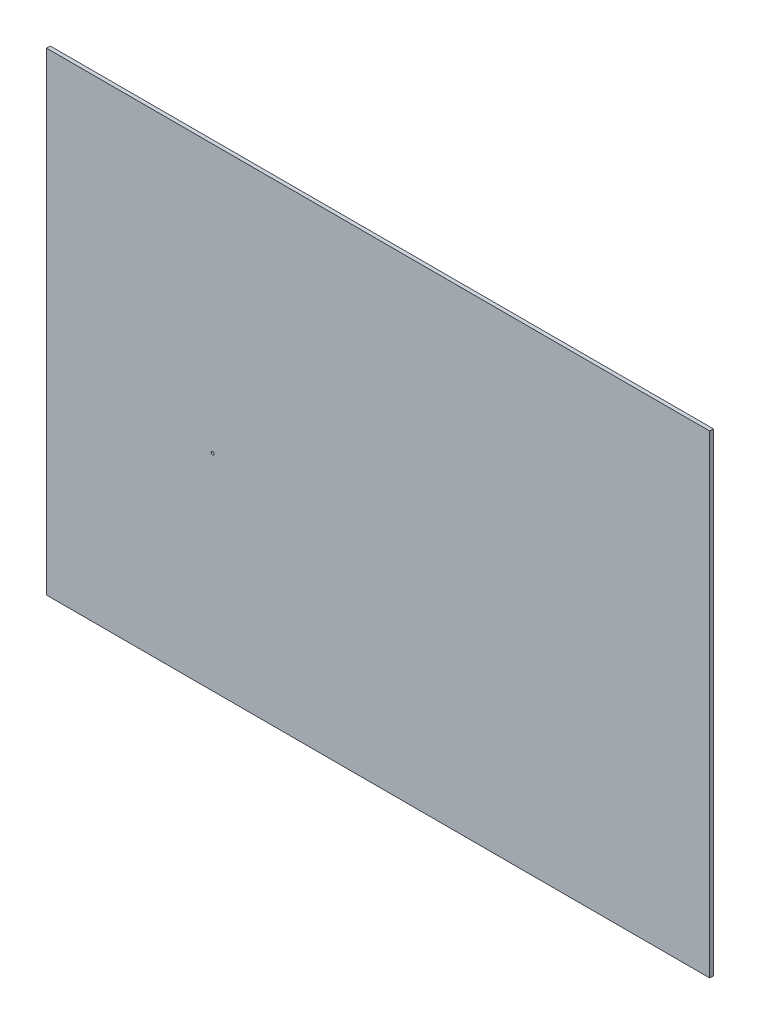
ISO-10303-21;
HEADER;
FILE_DESCRIPTION(('STEP AP214'),'2;1');
FILE_NAME('part.step','',(''),(''),'','','');
FILE_SCHEMA(('AUTOMOTIVE_DESIGN { 1 0 10303 214 1 1 1 1 }'));
ENDSEC;
DATA;
#1=APPLICATION_CONTEXT('core data for automotive mechanical design processes');
#2=APPLICATION_PROTOCOL_DEFINITION('international standard','automotive_design',2000,#1);
#3=PRODUCT_CONTEXT('',#1,'mechanical');
#4=PRODUCT('Part','Part','',(#3));
#5=PRODUCT_RELATED_PRODUCT_CATEGORY('part','',(#4));
#6=PRODUCT_DEFINITION_FORMATION('','',#4);
#7=PRODUCT_DEFINITION_CONTEXT('part definition',#1,'design');
#8=PRODUCT_DEFINITION('design','',#6,#7);
#9=PRODUCT_DEFINITION_SHAPE('','',#8);
#10=(LENGTH_UNIT() NAMED_UNIT(*) SI_UNIT(.MILLI.,.METRE.));
#11=(NAMED_UNIT(*) PLANE_ANGLE_UNIT() SI_UNIT($,.RADIAN.));
#12=(NAMED_UNIT(*) SI_UNIT($,.STERADIAN.) SOLID_ANGLE_UNIT());
#13=UNCERTAINTY_MEASURE_WITH_UNIT(LENGTH_MEASURE(1.E-05),#10,'distance_accuracy_value','');
#14=(GEOMETRIC_REPRESENTATION_CONTEXT(3) GLOBAL_UNCERTAINTY_ASSIGNED_CONTEXT((#13)) GLOBAL_UNIT_ASSIGNED_CONTEXT((#10,
#11,#12)) REPRESENTATION_CONTEXT('',''));
#15=CARTESIAN_POINT('',(0.,0.,0.));
#16=DIRECTION('',(0.,0.,1.));
#17=DIRECTION('',(1.,0.,0.));
#18=AXIS2_PLACEMENT_3D('',#15,#16,#17);
#19=CARTESIAN_POINT('',(25.4,75.4,0.39116));
#20=DIRECTION('',(1.,0.,0.));
#21=DIRECTION('',(0.,0.,-1.));
#22=AXIS2_PLACEMENT_3D('',#19,#20,#21);
#23=PLANE('',#22);
#24=DIRECTION('',(0.,-1.,0.));
#25=VECTOR('',#24,1.);
#26=CARTESIAN_POINT('',(25.4,75.4,0.));
#27=LINE('',#26,#25);
#28=CARTESIAN_POINT('',(25.4,75.4,0.));
#29=VERTEX_POINT('',#28);
#30=CARTESIAN_POINT('',(25.4,25.4,0.));
#31=VERTEX_POINT('',#30);
#32=EDGE_CURVE('E102',#29,#31,#27,.T.);
#33=ORIENTED_EDGE('',*,*,#32,.T.);
#34=DIRECTION('',(0.,0.,-1.));
#35=VECTOR('',#34,1.);
#36=CARTESIAN_POINT('',(25.4,25.4,0.39116));
#37=LINE('',#36,#35);
#38=CARTESIAN_POINT('',(25.4,25.4,0.39116));
#39=VERTEX_POINT('',#38);
#40=EDGE_CURVE('E11',#39,#31,#37,.T.);
#41=ORIENTED_EDGE('',*,*,#40,.F.);
#42=DIRECTION('',(0.,-1.,0.));
#43=VECTOR('',#42,1.);
#44=CARTESIAN_POINT('',(25.4,75.4,0.39116));
#45=LINE('',#44,#43);
#46=CARTESIAN_POINT('',(25.4,75.4,0.39116));
#47=VERTEX_POINT('',#46);
#48=EDGE_CURVE('E90',#47,#39,#45,.T.);
#49=ORIENTED_EDGE('',*,*,#48,.F.);
#50=DIRECTION('',(0.,0.,-1.));
#51=VECTOR('',#50,1.);
#52=CARTESIAN_POINT('',(25.4,75.4,0.39116));
#53=LINE('',#52,#51);
#54=EDGE_CURVE('E98',#47,#29,#53,.T.);
#55=ORIENTED_EDGE('',*,*,#54,.T.);
#56=EDGE_LOOP('',(#33,#41,#49,#55));
#57=FACE_BOUND('',#56,.T.);
#58=ADVANCED_FACE('F39',(#57),#23,.F.);
#59=CARTESIAN_POINT('',(25.4,25.4,0.39116));
#60=DIRECTION('',(0.,1.,0.));
#61=DIRECTION('',(0.,0.,1.));
#62=AXIS2_PLACEMENT_3D('',#59,#60,#61);
#63=PLANE('',#62);
#64=DIRECTION('',(1.,0.,0.));
#65=VECTOR('',#64,1.);
#66=CARTESIAN_POINT('',(25.4,25.4,0.));
#67=LINE('',#66,#65);
#68=CARTESIAN_POINT('',(95.4,25.4,0.));
#69=VERTEX_POINT('',#68);
#70=EDGE_CURVE('E94',#31,#69,#67,.T.);
#71=ORIENTED_EDGE('',*,*,#70,.T.);
#72=DIRECTION('',(0.,0.,-1.));
#73=VECTOR('',#72,1.);
#74=CARTESIAN_POINT('',(95.4,25.4,0.39116));
#75=LINE('',#74,#73);
#76=CARTESIAN_POINT('',(95.4,25.4,0.39116));
#77=VERTEX_POINT('',#76);
#78=EDGE_CURVE('E47',#77,#69,#75,.T.);
#79=ORIENTED_EDGE('',*,*,#78,.F.);
#80=DIRECTION('',(1.,0.,0.));
#81=VECTOR('',#80,1.);
#82=CARTESIAN_POINT('',(25.4,25.4,0.39116));
#83=LINE('',#82,#81);
#84=EDGE_CURVE('E85',#39,#77,#83,.T.);
#85=ORIENTED_EDGE('',*,*,#84,.F.);
#86=ORIENTED_EDGE('',*,*,#40,.T.);
#87=EDGE_LOOP('',(#71,#79,#85,#86));
#88=FACE_BOUND('',#87,.T.);
#89=ADVANCED_FACE('F93',(#88),#63,.F.);
#90=CARTESIAN_POINT('',(95.4,25.4,0.39116));
#91=DIRECTION('',(-1.,0.,0.));
#92=DIRECTION('',(0.,0.,1.));
#93=AXIS2_PLACEMENT_3D('',#90,#91,#92);
#94=PLANE('',#93);
#95=DIRECTION('',(0.,1.,0.));
#96=VECTOR('',#95,1.);
#97=CARTESIAN_POINT('',(95.4,25.4,0.));
#98=LINE('',#97,#96);
#99=CARTESIAN_POINT('',(95.4,75.4,0.));
#100=VERTEX_POINT('',#99);
#101=EDGE_CURVE('E72',#69,#100,#98,.T.);
#102=ORIENTED_EDGE('',*,*,#101,.T.);
#103=DIRECTION('',(0.,0.,-1.));
#104=VECTOR('',#103,1.);
#105=CARTESIAN_POINT('',(95.4,75.4,0.39116));
#106=LINE('',#105,#104);
#107=CARTESIAN_POINT('',(95.4,75.4,0.39116));
#108=VERTEX_POINT('',#107);
#109=EDGE_CURVE('E95',#108,#100,#106,.T.);
#110=ORIENTED_EDGE('',*,*,#109,.F.);
#111=DIRECTION('',(0.,1.,0.));
#112=VECTOR('',#111,1.);
#113=CARTESIAN_POINT('',(95.4,25.4,0.39116));
#114=LINE('',#113,#112);
#115=EDGE_CURVE('E88',#77,#108,#114,.T.);
#116=ORIENTED_EDGE('',*,*,#115,.F.);
#117=ORIENTED_EDGE('',*,*,#78,.T.);
#118=EDGE_LOOP('',(#102,#110,#116,#117));
#119=FACE_BOUND('',#118,.T.);
#120=ADVANCED_FACE('F96',(#119),#94,.F.);
#121=CARTESIAN_POINT('',(95.4,75.4,0.39116));
#122=DIRECTION('',(0.,-1.,0.));
#123=DIRECTION('',(0.,0.,-1.));
#124=AXIS2_PLACEMENT_3D('',#121,#122,#123);
#125=PLANE('',#124);
#126=DIRECTION('',(-1.,0.,0.));
#127=VECTOR('',#126,1.);
#128=CARTESIAN_POINT('',(95.4,75.4,0.));
#129=LINE('',#128,#127);
#130=EDGE_CURVE('E78',#100,#29,#129,.T.);
#131=ORIENTED_EDGE('',*,*,#130,.T.);
#132=ORIENTED_EDGE('',*,*,#54,.F.);
#133=DIRECTION('',(-1.,0.,0.));
#134=VECTOR('',#133,1.);
#135=CARTESIAN_POINT('',(95.4,75.4,0.39116));
#136=LINE('',#135,#134);
#137=EDGE_CURVE('E55',#108,#47,#136,.T.);
#138=ORIENTED_EDGE('',*,*,#137,.F.);
#139=ORIENTED_EDGE('',*,*,#109,.T.);
#140=EDGE_LOOP('',(#131,#132,#138,#139));
#141=FACE_BOUND('',#140,.T.);
#142=ADVANCED_FACE('F110',(#141),#125,.F.);
#143=CARTESIAN_POINT('',(0.,0.,0.39116));
#144=DIRECTION('',(0.,0.,1.));
#145=DIRECTION('',(1.,0.,0.));
#146=AXIS2_PLACEMENT_3D('',#143,#144,#145);
#147=PLANE('',#146);
#148=CARTESIAN_POINT('',(42.926,47.128,0.39116));
#149=DIRECTION('',(0.,0.,1.));
#150=DIRECTION('',(1.,0.,0.));
#151=AXIS2_PLACEMENT_3D('',#148,#149,#150);
#152=CIRCLE('',#151,0.149999999999997);
#153=CARTESIAN_POINT('',(43.076,47.128,0.39116));
#154=VERTEX_POINT('',#153);
#155=EDGE_CURVE('E116',#154,#154,#152,.T.);
#156=ORIENTED_EDGE('',*,*,#155,.F.);
#157=EDGE_LOOP('',(#156));
#158=FACE_BOUND('',#157,.T.);
#159=ORIENTED_EDGE('',*,*,#48,.T.);
#160=ORIENTED_EDGE('',*,*,#84,.T.);
#161=ORIENTED_EDGE('',*,*,#115,.T.);
#162=ORIENTED_EDGE('',*,*,#137,.T.);
#163=EDGE_LOOP('',(#159,#160,#161,#162));
#164=FACE_BOUND('',#163,.T.);
#165=ADVANCED_FACE('F86',(#158,#164),#147,.T.);
#166=CARTESIAN_POINT('',(0.,0.,0.));
#167=DIRECTION('',(0.,0.,1.));
#168=DIRECTION('',(1.,0.,0.));
#169=AXIS2_PLACEMENT_3D('',#166,#167,#168);
#170=PLANE('',#169);
#171=CARTESIAN_POINT('',(42.926,47.128,0.));
#172=DIRECTION('',(0.,0.,1.));
#173=DIRECTION('',(1.,0.,0.));
#174=AXIS2_PLACEMENT_3D('',#171,#172,#173);
#175=CIRCLE('',#174,0.149999999999997);
#176=CARTESIAN_POINT('',(43.076,47.128,0.));
#177=VERTEX_POINT('',#176);
#178=EDGE_CURVE('E105',#177,#177,#175,.T.);
#179=ORIENTED_EDGE('',*,*,#178,.T.);
#180=EDGE_LOOP('',(#179));
#181=FACE_BOUND('',#180,.T.);
#182=ORIENTED_EDGE('',*,*,#32,.F.);
#183=ORIENTED_EDGE('',*,*,#130,.F.);
#184=ORIENTED_EDGE('',*,*,#101,.F.);
#185=ORIENTED_EDGE('',*,*,#70,.F.);
#186=EDGE_LOOP('',(#182,#183,#184,#185));
#187=FACE_BOUND('',#186,.T.);
#188=ADVANCED_FACE('F113',(#181,#187),#170,.F.);
#189=CARTESIAN_POINT('',(42.926,47.128,0.));
#190=DIRECTION('',(0.,0.,1.));
#191=DIRECTION('',(1.,0.,0.));
#192=AXIS2_PLACEMENT_3D('',#189,#190,#191);
#193=CYLINDRICAL_SURFACE('',#192,0.149999999999997);
#194=ORIENTED_EDGE('',*,*,#178,.F.);
#195=EDGE_LOOP('',(#194));
#196=FACE_BOUND('',#195,.T.);
#197=ORIENTED_EDGE('',*,*,#155,.T.);
#198=EDGE_LOOP('',(#197));
#199=FACE_BOUND('',#198,.T.);
#200=ADVANCED_FACE('F123',(#196,#199),#193,.F.);
#201=CLOSED_SHELL('',(#58,#89,#120,#142,#165,#188,#200));
#202=MANIFOLD_SOLID_BREP('B2',#201);
#203=ADVANCED_BREP_SHAPE_REPRESENTATION('',(#18,#202),#14);
#204=SHAPE_DEFINITION_REPRESENTATION(#9,#203);
ENDSEC;
END-ISO-10303-21;
